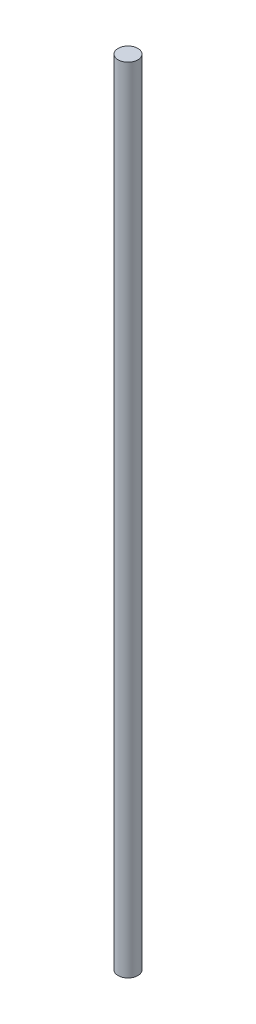
ISO-10303-21;
HEADER;
FILE_DESCRIPTION(('STEP AP214'),'2;1');
FILE_NAME('part.step','',(''),(''),'','','');
FILE_SCHEMA(('AUTOMOTIVE_DESIGN { 1 0 10303 214 1 1 1 1 }'));
ENDSEC;
DATA;
#1=APPLICATION_CONTEXT('core data for automotive mechanical design processes');
#2=APPLICATION_PROTOCOL_DEFINITION('international standard','automotive_design',2000,#1);
#3=PRODUCT_CONTEXT('',#1,'mechanical');
#4=PRODUCT('Part','Part','',(#3));
#5=PRODUCT_RELATED_PRODUCT_CATEGORY('part','',(#4));
#6=PRODUCT_DEFINITION_FORMATION('','',#4);
#7=PRODUCT_DEFINITION_CONTEXT('part definition',#1,'design');
#8=PRODUCT_DEFINITION('design','',#6,#7);
#9=PRODUCT_DEFINITION_SHAPE('','',#8);
#10=(LENGTH_UNIT() NAMED_UNIT(*) SI_UNIT(.MILLI.,.METRE.));
#11=(NAMED_UNIT(*) PLANE_ANGLE_UNIT() SI_UNIT($,.RADIAN.));
#12=(NAMED_UNIT(*) SI_UNIT($,.STERADIAN.) SOLID_ANGLE_UNIT());
#13=UNCERTAINTY_MEASURE_WITH_UNIT(LENGTH_MEASURE(1.E-05),#10,'distance_accuracy_value','');
#14=(GEOMETRIC_REPRESENTATION_CONTEXT(3) GLOBAL_UNCERTAINTY_ASSIGNED_CONTEXT((#13)) GLOBAL_UNIT_ASSIGNED_CONTEXT((#10,
#11,#12)) REPRESENTATION_CONTEXT('',''));
#15=CARTESIAN_POINT('',(0.,0.,0.));
#16=DIRECTION('',(0.,0.,1.));
#17=DIRECTION('',(1.,0.,0.));
#18=AXIS2_PLACEMENT_3D('',#15,#16,#17);
#19=CARTESIAN_POINT('',(0.,400.,0.));
#20=DIRECTION('',(0.,-1.,0.));
#21=DIRECTION('',(0.,0.,-1.));
#22=AXIS2_PLACEMENT_3D('',#19,#20,#21);
#23=CYLINDRICAL_SURFACE('',#22,5.);
#24=CARTESIAN_POINT('',(0.,400.,0.));
#25=DIRECTION('',(0.,1.,0.));
#26=DIRECTION('',(0.,0.,1.));
#27=AXIS2_PLACEMENT_3D('',#24,#25,#26);
#28=CIRCLE('',#27,5.);
#29=CARTESIAN_POINT('',(0.,400.,5.));
#30=VERTEX_POINT('',#29);
#31=EDGE_CURVE('E10',#30,#30,#28,.T.);
#32=ORIENTED_EDGE('',*,*,#31,.F.);
#33=EDGE_LOOP('',(#32));
#34=FACE_BOUND('',#33,.T.);
#35=CARTESIAN_POINT('',(0.,0.,0.));
#36=DIRECTION('',(0.,1.,0.));
#37=DIRECTION('',(0.,0.,1.));
#38=AXIS2_PLACEMENT_3D('',#35,#36,#37);
#39=CIRCLE('',#38,5.);
#40=CARTESIAN_POINT('',(0.,0.,5.));
#41=VERTEX_POINT('',#40);
#42=EDGE_CURVE('E35',#41,#41,#39,.T.);
#43=ORIENTED_EDGE('',*,*,#42,.T.);
#44=EDGE_LOOP('',(#43));
#45=FACE_BOUND('',#44,.T.);
#46=ADVANCED_FACE('F32',(#34,#45),#23,.T.);
#47=CARTESIAN_POINT('',(0.,400.,0.));
#48=DIRECTION('',(0.,1.,0.));
#49=DIRECTION('',(0.,0.,1.));
#50=AXIS2_PLACEMENT_3D('',#47,#48,#49);
#51=PLANE('',#50);
#52=ORIENTED_EDGE('',*,*,#31,.T.);
#53=EDGE_LOOP('',(#52));
#54=FACE_BOUND('',#53,.T.);
#55=ADVANCED_FACE('F47',(#54),#51,.T.);
#56=CARTESIAN_POINT('',(0.,0.,0.));
#57=DIRECTION('',(0.,1.,0.));
#58=DIRECTION('',(0.,0.,1.));
#59=AXIS2_PLACEMENT_3D('',#56,#57,#58);
#60=PLANE('',#59);
#61=ORIENTED_EDGE('',*,*,#42,.F.);
#62=EDGE_LOOP('',(#61));
#63=FACE_BOUND('',#62,.T.);
#64=ADVANCED_FACE('F45',(#63),#60,.F.);
#65=CLOSED_SHELL('',(#46,#55,#64));
#66=MANIFOLD_SOLID_BREP('B2',#65);
#67=ADVANCED_BREP_SHAPE_REPRESENTATION('',(#18,#66),#14);
#68=SHAPE_DEFINITION_REPRESENTATION(#9,#67);
ENDSEC;
END-ISO-10303-21;
